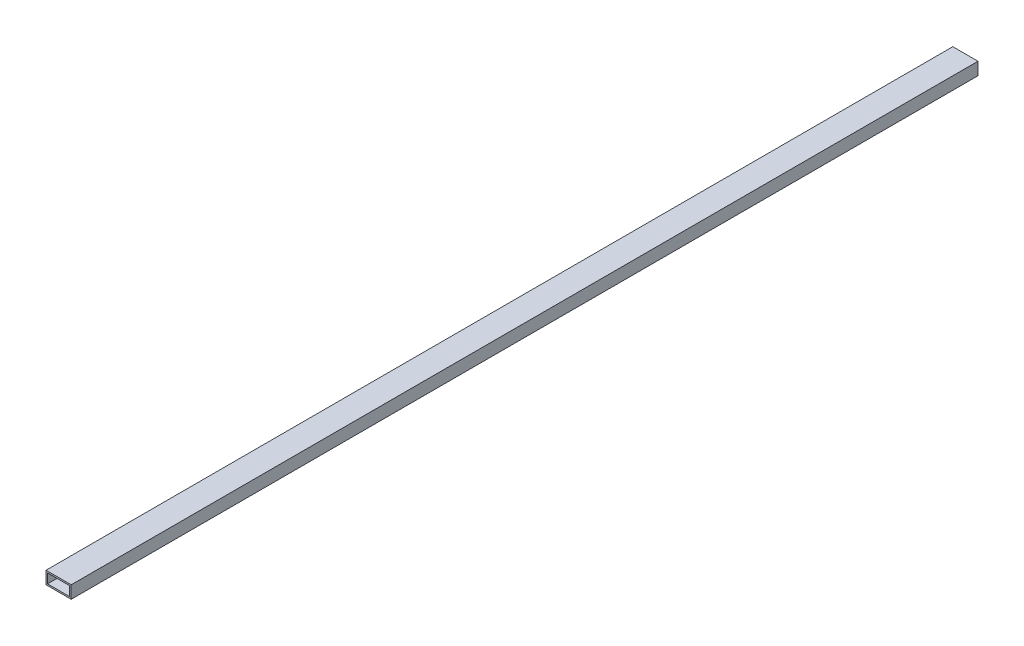
ISO-10303-21;
HEADER;
FILE_DESCRIPTION(('STEP AP214'),'2;1');
FILE_NAME('part.step','',(''),(''),'','','');
FILE_SCHEMA(('AUTOMOTIVE_DESIGN { 1 0 10303 214 1 1 1 1 }'));
ENDSEC;
DATA;
#1=APPLICATION_CONTEXT('core data for automotive mechanical design processes');
#2=APPLICATION_PROTOCOL_DEFINITION('international standard','automotive_design',2000,#1);
#3=PRODUCT_CONTEXT('',#1,'mechanical');
#4=PRODUCT('Part','Part','',(#3));
#5=PRODUCT_RELATED_PRODUCT_CATEGORY('part','',(#4));
#6=PRODUCT_DEFINITION_FORMATION('','',#4);
#7=PRODUCT_DEFINITION_CONTEXT('part definition',#1,'design');
#8=PRODUCT_DEFINITION('design','',#6,#7);
#9=PRODUCT_DEFINITION_SHAPE('','',#8);
#10=(LENGTH_UNIT() NAMED_UNIT(*) SI_UNIT(.MILLI.,.METRE.));
#11=(NAMED_UNIT(*) PLANE_ANGLE_UNIT() SI_UNIT($,.RADIAN.));
#12=(NAMED_UNIT(*) SI_UNIT($,.STERADIAN.) SOLID_ANGLE_UNIT());
#13=UNCERTAINTY_MEASURE_WITH_UNIT(LENGTH_MEASURE(1.E-05),#10,'distance_accuracy_value','');
#14=(GEOMETRIC_REPRESENTATION_CONTEXT(3) GLOBAL_UNCERTAINTY_ASSIGNED_CONTEXT((#13)) GLOBAL_UNIT_ASSIGNED_CONTEXT((#10,
#11,#12)) REPRESENTATION_CONTEXT('',''));
#15=CARTESIAN_POINT('',(0.,0.,0.));
#16=DIRECTION('',(0.,0.,1.));
#17=DIRECTION('',(1.,0.,0.));
#18=AXIS2_PLACEMENT_3D('',#15,#16,#17);
#19=CARTESIAN_POINT('',(0.,0.,457.2));
#20=DIRECTION('',(0.,0.,1.));
#21=DIRECTION('',(1.,0.,0.));
#22=AXIS2_PLACEMENT_3D('',#19,#20,#21);
#23=PLANE('',#22);
#24=DIRECTION('',(0.,-1.,0.));
#25=VECTOR('',#24,1.);
#26=CARTESIAN_POINT('',(-12.7,6.35,457.2));
#27=LINE('',#26,#25);
#28=CARTESIAN_POINT('',(-12.7,6.35,457.2));
#29=VERTEX_POINT('',#28);
#30=CARTESIAN_POINT('',(-12.7,-6.35,457.2));
#31=VERTEX_POINT('',#30);
#32=EDGE_CURVE('E119',#29,#31,#27,.T.);
#33=ORIENTED_EDGE('',*,*,#32,.T.);
#34=DIRECTION('',(1.,0.,0.));
#35=VECTOR('',#34,1.);
#36=CARTESIAN_POINT('',(-12.7,-6.35,457.2));
#37=LINE('',#36,#35);
#38=CARTESIAN_POINT('',(12.7,-6.35,457.2));
#39=VERTEX_POINT('',#38);
#40=EDGE_CURVE('E178',#31,#39,#37,.T.);
#41=ORIENTED_EDGE('',*,*,#40,.T.);
#42=DIRECTION('',(0.,1.,0.));
#43=VECTOR('',#42,1.);
#44=CARTESIAN_POINT('',(12.7,-6.35,457.2));
#45=LINE('',#44,#43);
#46=CARTESIAN_POINT('',(12.7,6.35,457.2));
#47=VERTEX_POINT('',#46);
#48=EDGE_CURVE('E181',#39,#47,#45,.T.);
#49=ORIENTED_EDGE('',*,*,#48,.T.);
#50=DIRECTION('',(-1.,0.,0.));
#51=VECTOR('',#50,1.);
#52=CARTESIAN_POINT('',(12.7,6.35,457.2));
#53=LINE('',#52,#51);
#54=EDGE_CURVE('E65',#47,#29,#53,.T.);
#55=ORIENTED_EDGE('',*,*,#54,.T.);
#56=EDGE_LOOP('',(#33,#41,#49,#55));
#57=FACE_BOUND('',#56,.T.);
#58=DIRECTION('',(1.,0.,0.));
#59=VECTOR('',#58,1.);
#60=CARTESIAN_POINT('',(-11.1125,-4.7625,457.2));
#61=LINE('',#60,#59);
#62=CARTESIAN_POINT('',(-11.1125,-4.7625,457.2));
#63=VERTEX_POINT('',#62);
#64=CARTESIAN_POINT('',(11.1125,-4.7625,457.2));
#65=VERTEX_POINT('',#64);
#66=EDGE_CURVE('E160',#63,#65,#61,.T.);
#67=ORIENTED_EDGE('',*,*,#66,.F.);
#68=DIRECTION('',(0.,-1.,0.));
#69=VECTOR('',#68,1.);
#70=CARTESIAN_POINT('',(-11.1125,4.7625,457.2));
#71=LINE('',#70,#69);
#72=CARTESIAN_POINT('',(-11.1125,4.7625,457.2));
#73=VERTEX_POINT('',#72);
#74=EDGE_CURVE('E115',#73,#63,#71,.T.);
#75=ORIENTED_EDGE('',*,*,#74,.F.);
#76=DIRECTION('',(-1.,0.,0.));
#77=VECTOR('',#76,1.);
#78=CARTESIAN_POINT('',(11.1125,4.7625,457.2));
#79=LINE('',#78,#77);
#80=CARTESIAN_POINT('',(11.1125,4.7625,457.2));
#81=VERTEX_POINT('',#80);
#82=EDGE_CURVE('E166',#81,#73,#79,.T.);
#83=ORIENTED_EDGE('',*,*,#82,.F.);
#84=DIRECTION('',(0.,1.,0.));
#85=VECTOR('',#84,1.);
#86=CARTESIAN_POINT('',(11.1125,-4.7625,457.2));
#87=LINE('',#86,#85);
#88=EDGE_CURVE('E163',#65,#81,#87,.T.);
#89=ORIENTED_EDGE('',*,*,#88,.F.);
#90=EDGE_LOOP('',(#67,#75,#83,#89));
#91=FACE_BOUND('',#90,.T.);
#92=ADVANCED_FACE('F41',(#57,#91),#23,.T.);
#93=CARTESIAN_POINT('',(-12.7,6.35,457.2));
#94=DIRECTION('',(1.,0.,0.));
#95=DIRECTION('',(0.,0.,-1.));
#96=AXIS2_PLACEMENT_3D('',#93,#94,#95);
#97=PLANE('',#96);
#98=DIRECTION('',(0.,0.,-1.));
#99=VECTOR('',#98,1.);
#100=CARTESIAN_POINT('',(-12.7,6.35,457.2));
#101=LINE('',#100,#99);
#102=CARTESIAN_POINT('',(-12.7,6.35,-457.2));
#103=VERTEX_POINT('',#102);
#104=EDGE_CURVE('E186',#29,#103,#101,.T.);
#105=ORIENTED_EDGE('',*,*,#104,.T.);
#106=DIRECTION('',(0.,-1.,0.));
#107=VECTOR('',#106,1.);
#108=CARTESIAN_POINT('',(-12.7,6.35,-457.2));
#109=LINE('',#108,#107);
#110=CARTESIAN_POINT('',(-12.7,-6.35,-457.2));
#111=VERTEX_POINT('',#110);
#112=EDGE_CURVE('E142',#103,#111,#109,.T.);
#113=ORIENTED_EDGE('',*,*,#112,.T.);
#114=DIRECTION('',(0.,0.,-1.));
#115=VECTOR('',#114,1.);
#116=CARTESIAN_POINT('',(-12.7,-6.35,457.2));
#117=LINE('',#116,#115);
#118=EDGE_CURVE('E11',#31,#111,#117,.T.);
#119=ORIENTED_EDGE('',*,*,#118,.F.);
#120=ORIENTED_EDGE('',*,*,#32,.F.);
#121=EDGE_LOOP('',(#105,#113,#119,#120));
#122=FACE_BOUND('',#121,.T.);
#123=ADVANCED_FACE('F43',(#122),#97,.F.);
#124=CARTESIAN_POINT('',(-12.7,-6.35,457.2));
#125=DIRECTION('',(0.,1.,0.));
#126=DIRECTION('',(-1.,0.,0.));
#127=AXIS2_PLACEMENT_3D('',#124,#125,#126);
#128=PLANE('',#127);
#129=ORIENTED_EDGE('',*,*,#118,.T.);
#130=DIRECTION('',(1.,0.,0.));
#131=VECTOR('',#130,1.);
#132=CARTESIAN_POINT('',(-12.7,-6.35,-457.2));
#133=LINE('',#132,#131);
#134=CARTESIAN_POINT('',(12.7,-6.35,-457.2));
#135=VERTEX_POINT('',#134);
#136=EDGE_CURVE('E146',#111,#135,#133,.T.);
#137=ORIENTED_EDGE('',*,*,#136,.T.);
#138=DIRECTION('',(0.,0.,-1.));
#139=VECTOR('',#138,1.);
#140=CARTESIAN_POINT('',(12.7,-6.35,457.2));
#141=LINE('',#140,#139);
#142=EDGE_CURVE('E50',#39,#135,#141,.T.);
#143=ORIENTED_EDGE('',*,*,#142,.F.);
#144=ORIENTED_EDGE('',*,*,#40,.F.);
#145=EDGE_LOOP('',(#129,#137,#143,#144));
#146=FACE_BOUND('',#145,.T.);
#147=ADVANCED_FACE('F202',(#146),#128,.F.);
#148=CARTESIAN_POINT('',(12.7,-6.35,457.2));
#149=DIRECTION('',(-1.,0.,0.));
#150=DIRECTION('',(0.,0.,1.));
#151=AXIS2_PLACEMENT_3D('',#148,#149,#150);
#152=PLANE('',#151);
#153=ORIENTED_EDGE('',*,*,#142,.T.);
#154=DIRECTION('',(0.,1.,0.));
#155=VECTOR('',#154,1.);
#156=CARTESIAN_POINT('',(12.7,-6.35,-457.2));
#157=LINE('',#156,#155);
#158=CARTESIAN_POINT('',(12.7,6.35,-457.2));
#159=VERTEX_POINT('',#158);
#160=EDGE_CURVE('E150',#135,#159,#157,.T.);
#161=ORIENTED_EDGE('',*,*,#160,.T.);
#162=DIRECTION('',(0.,0.,-1.));
#163=VECTOR('',#162,1.);
#164=CARTESIAN_POINT('',(12.7,6.35,457.2));
#165=LINE('',#164,#163);
#166=EDGE_CURVE('E189',#47,#159,#165,.T.);
#167=ORIENTED_EDGE('',*,*,#166,.F.);
#168=ORIENTED_EDGE('',*,*,#48,.F.);
#169=EDGE_LOOP('',(#153,#161,#167,#168));
#170=FACE_BOUND('',#169,.T.);
#171=ADVANCED_FACE('F196',(#170),#152,.F.);
#172=CARTESIAN_POINT('',(12.7,6.35,457.2));
#173=DIRECTION('',(0.,-1.,0.));
#174=DIRECTION('',(0.,0.,-1.));
#175=AXIS2_PLACEMENT_3D('',#172,#173,#174);
#176=PLANE('',#175);
#177=ORIENTED_EDGE('',*,*,#166,.T.);
#178=DIRECTION('',(-1.,0.,0.));
#179=VECTOR('',#178,1.);
#180=CARTESIAN_POINT('',(12.7,6.35,-457.2));
#181=LINE('',#180,#179);
#182=EDGE_CURVE('E154',#159,#103,#181,.T.);
#183=ORIENTED_EDGE('',*,*,#182,.T.);
#184=ORIENTED_EDGE('',*,*,#104,.F.);
#185=ORIENTED_EDGE('',*,*,#54,.F.);
#186=EDGE_LOOP('',(#177,#183,#184,#185));
#187=FACE_BOUND('',#186,.T.);
#188=ADVANCED_FACE('F207',(#187),#176,.F.);
#189=CARTESIAN_POINT('',(-11.1125,4.7625,457.2));
#190=DIRECTION('',(1.,0.,0.));
#191=DIRECTION('',(0.,1.,0.));
#192=AXIS2_PLACEMENT_3D('',#189,#190,#191);
#193=PLANE('',#192);
#194=DIRECTION('',(0.,0.,-1.));
#195=VECTOR('',#194,1.);
#196=CARTESIAN_POINT('',(-11.1125,-4.7625,457.2));
#197=LINE('',#196,#195);
#198=CARTESIAN_POINT('',(-11.1125,-4.7625,-457.2));
#199=VERTEX_POINT('',#198);
#200=EDGE_CURVE('E107',#63,#199,#197,.T.);
#201=ORIENTED_EDGE('',*,*,#200,.T.);
#202=DIRECTION('',(0.,-1.,0.));
#203=VECTOR('',#202,1.);
#204=CARTESIAN_POINT('',(-11.1125,4.7625,-457.2));
#205=LINE('',#204,#203);
#206=CARTESIAN_POINT('',(-11.1125,4.7625,-457.2));
#207=VERTEX_POINT('',#206);
#208=EDGE_CURVE('E112',#207,#199,#205,.T.);
#209=ORIENTED_EDGE('',*,*,#208,.F.);
#210=DIRECTION('',(0.,0.,-1.));
#211=VECTOR('',#210,1.);
#212=CARTESIAN_POINT('',(-11.1125,4.7625,457.2));
#213=LINE('',#212,#211);
#214=EDGE_CURVE('E169',#73,#207,#213,.T.);
#215=ORIENTED_EDGE('',*,*,#214,.F.);
#216=ORIENTED_EDGE('',*,*,#74,.T.);
#217=EDGE_LOOP('',(#201,#209,#215,#216));
#218=FACE_BOUND('',#217,.T.);
#219=ADVANCED_FACE('F109',(#218),#193,.T.);
#220=CARTESIAN_POINT('',(-11.1125,-4.7625,457.2));
#221=DIRECTION('',(0.,1.,0.));
#222=DIRECTION('',(-1.,0.,0.));
#223=AXIS2_PLACEMENT_3D('',#220,#221,#222);
#224=PLANE('',#223);
#225=DIRECTION('',(0.,0.,-1.));
#226=VECTOR('',#225,1.);
#227=CARTESIAN_POINT('',(11.1125,-4.7625,457.2));
#228=LINE('',#227,#226);
#229=CARTESIAN_POINT('',(11.1125,-4.7625,-457.2));
#230=VERTEX_POINT('',#229);
#231=EDGE_CURVE('E120',#65,#230,#228,.T.);
#232=ORIENTED_EDGE('',*,*,#231,.T.);
#233=DIRECTION('',(1.,0.,0.));
#234=VECTOR('',#233,1.);
#235=CARTESIAN_POINT('',(-11.1125,-4.7625,-457.2));
#236=LINE('',#235,#234);
#237=EDGE_CURVE('E123',#199,#230,#236,.T.);
#238=ORIENTED_EDGE('',*,*,#237,.F.);
#239=ORIENTED_EDGE('',*,*,#200,.F.);
#240=ORIENTED_EDGE('',*,*,#66,.T.);
#241=EDGE_LOOP('',(#232,#238,#239,#240));
#242=FACE_BOUND('',#241,.T.);
#243=ADVANCED_FACE('F124',(#242),#224,.T.);
#244=CARTESIAN_POINT('',(11.1125,-4.7625,457.2));
#245=DIRECTION('',(-1.,0.,0.));
#246=DIRECTION('',(0.,-1.,0.));
#247=AXIS2_PLACEMENT_3D('',#244,#245,#246);
#248=PLANE('',#247);
#249=DIRECTION('',(0.,0.,-1.));
#250=VECTOR('',#249,1.);
#251=CARTESIAN_POINT('',(11.1125,4.7625,457.2));
#252=LINE('',#251,#250);
#253=CARTESIAN_POINT('',(11.1125,4.7625,-457.2));
#254=VERTEX_POINT('',#253);
#255=EDGE_CURVE('E57',#81,#254,#252,.T.);
#256=ORIENTED_EDGE('',*,*,#255,.T.);
#257=DIRECTION('',(0.,1.,0.));
#258=VECTOR('',#257,1.);
#259=CARTESIAN_POINT('',(11.1125,-4.7625,-457.2));
#260=LINE('',#259,#258);
#261=EDGE_CURVE('E130',#230,#254,#260,.T.);
#262=ORIENTED_EDGE('',*,*,#261,.F.);
#263=ORIENTED_EDGE('',*,*,#231,.F.);
#264=ORIENTED_EDGE('',*,*,#88,.T.);
#265=EDGE_LOOP('',(#256,#262,#263,#264));
#266=FACE_BOUND('',#265,.T.);
#267=ADVANCED_FACE('F225',(#266),#248,.T.);
#268=CARTESIAN_POINT('',(11.1125,4.7625,457.2));
#269=DIRECTION('',(0.,-1.,0.));
#270=DIRECTION('',(0.,0.,-1.));
#271=AXIS2_PLACEMENT_3D('',#268,#269,#270);
#272=PLANE('',#271);
#273=ORIENTED_EDGE('',*,*,#214,.T.);
#274=DIRECTION('',(-1.,0.,0.));
#275=VECTOR('',#274,1.);
#276=CARTESIAN_POINT('',(11.1125,4.7625,-457.2));
#277=LINE('',#276,#275);
#278=EDGE_CURVE('E134',#254,#207,#277,.T.);
#279=ORIENTED_EDGE('',*,*,#278,.F.);
#280=ORIENTED_EDGE('',*,*,#255,.F.);
#281=ORIENTED_EDGE('',*,*,#82,.T.);
#282=EDGE_LOOP('',(#273,#279,#280,#281));
#283=FACE_BOUND('',#282,.T.);
#284=ADVANCED_FACE('F228',(#283),#272,.T.);
#285=CARTESIAN_POINT('',(0.,0.,-457.2));
#286=DIRECTION('',(0.,0.,1.));
#287=DIRECTION('',(1.,0.,0.));
#288=AXIS2_PLACEMENT_3D('',#285,#286,#287);
#289=PLANE('',#288);
#290=ORIENTED_EDGE('',*,*,#278,.T.);
#291=ORIENTED_EDGE('',*,*,#208,.T.);
#292=ORIENTED_EDGE('',*,*,#237,.T.);
#293=ORIENTED_EDGE('',*,*,#261,.T.);
#294=EDGE_LOOP('',(#290,#291,#292,#293));
#295=FACE_BOUND('',#294,.T.);
#296=ORIENTED_EDGE('',*,*,#112,.F.);
#297=ORIENTED_EDGE('',*,*,#182,.F.);
#298=ORIENTED_EDGE('',*,*,#160,.F.);
#299=ORIENTED_EDGE('',*,*,#136,.F.);
#300=EDGE_LOOP('',(#296,#297,#298,#299));
#301=FACE_BOUND('',#300,.T.);
#302=ADVANCED_FACE('F132',(#295,#301),#289,.F.);
#303=CLOSED_SHELL('',(#92,#123,#147,#171,#188,#219,#243,#267,#284,#302));
#304=MANIFOLD_SOLID_BREP('B2',#303);
#305=ADVANCED_BREP_SHAPE_REPRESENTATION('',(#18,#304),#14);
#306=SHAPE_DEFINITION_REPRESENTATION(#9,#305);
ENDSEC;
END-ISO-10303-21;
